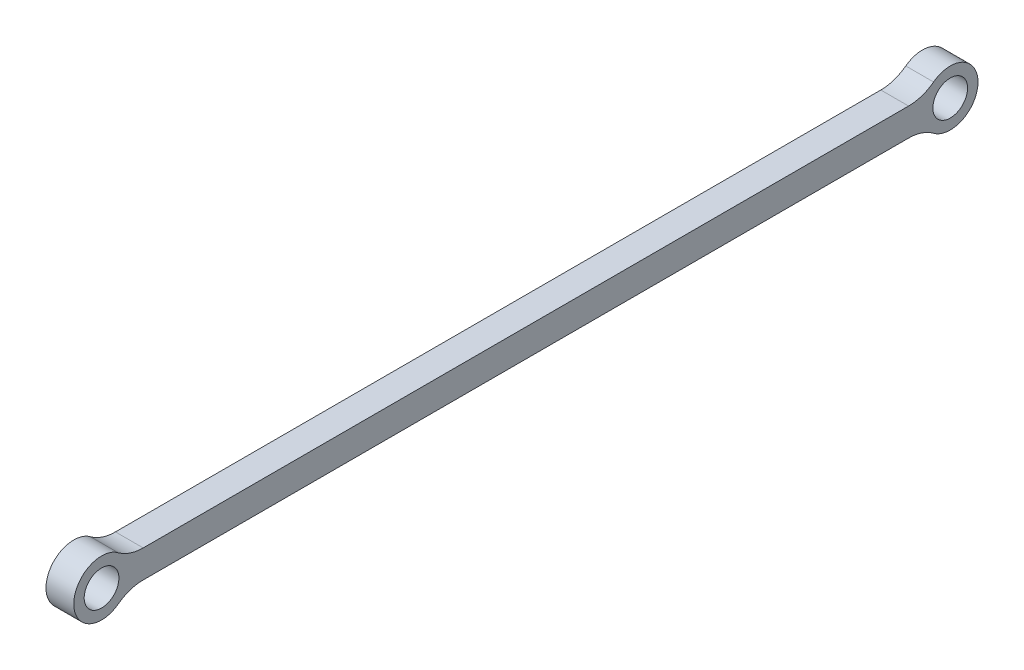
ISO-10303-21;
HEADER;
FILE_DESCRIPTION(('STEP AP214'),'2;1');
FILE_NAME('part.step','',(''),(''),'','','');
FILE_SCHEMA(('AUTOMOTIVE_DESIGN { 1 0 10303 214 1 1 1 1 }'));
ENDSEC;
DATA;
#1=APPLICATION_CONTEXT('core data for automotive mechanical design processes');
#2=APPLICATION_PROTOCOL_DEFINITION('international standard','automotive_design',2000,#1);
#3=PRODUCT_CONTEXT('',#1,'mechanical');
#4=PRODUCT('Part','Part','',(#3));
#5=PRODUCT_RELATED_PRODUCT_CATEGORY('part','',(#4));
#6=PRODUCT_DEFINITION_FORMATION('','',#4);
#7=PRODUCT_DEFINITION_CONTEXT('part definition',#1,'design');
#8=PRODUCT_DEFINITION('design','',#6,#7);
#9=PRODUCT_DEFINITION_SHAPE('','',#8);
#10=(LENGTH_UNIT() NAMED_UNIT(*) SI_UNIT(.MILLI.,.METRE.));
#11=(NAMED_UNIT(*) PLANE_ANGLE_UNIT() SI_UNIT($,.RADIAN.));
#12=(NAMED_UNIT(*) SI_UNIT($,.STERADIAN.) SOLID_ANGLE_UNIT());
#13=UNCERTAINTY_MEASURE_WITH_UNIT(LENGTH_MEASURE(1.E-05),#10,'distance_accuracy_value','');
#14=(GEOMETRIC_REPRESENTATION_CONTEXT(3) GLOBAL_UNCERTAINTY_ASSIGNED_CONTEXT((#13)) GLOBAL_UNIT_ASSIGNED_CONTEXT((#10,
#11,#12)) REPRESENTATION_CONTEXT('',''));
#15=CARTESIAN_POINT('',(0.,0.,0.));
#16=DIRECTION('',(0.,0.,1.));
#17=DIRECTION('',(1.,0.,0.));
#18=AXIS2_PLACEMENT_3D('',#15,#16,#17);
#19=CARTESIAN_POINT('',(8.,0.,0.));
#20=DIRECTION('',(1.,0.,0.));
#21=DIRECTION('',(0.,0.,-1.));
#22=AXIS2_PLACEMENT_3D('',#19,#20,#21);
#23=PLANE('',#22);
#24=DIRECTION('',(0.,0.,-1.));
#25=VECTOR('',#24,1.);
#26=CARTESIAN_POINT('',(8.,4.,-237.571796769724));
#27=LINE('',#26,#25);
#28=CARTESIAN_POINT('',(8.,3.99999999999997,-12.));
#29=VERTEX_POINT('',#28);
#30=CARTESIAN_POINT('',(8.,4.,-232.5));
#31=VERTEX_POINT('',#30);
#32=EDGE_CURVE('E133',#29,#31,#27,.T.);
#33=ORIENTED_EDGE('',*,*,#32,.F.);
#34=CARTESIAN_POINT('',(8.,16.,-12.));
#35=DIRECTION('',(1.,0.,0.));
#36=DIRECTION('',(0.,0.,-1.));
#37=AXIS2_PLACEMENT_3D('',#34,#35,#36);
#38=CIRCLE('',#37,12.);
#39=CARTESIAN_POINT('',(8.,6.39999999999999,-4.80000000000001));
#40=VERTEX_POINT('',#39);
#41=EDGE_CURVE('E168',#29,#40,#38,.F.);
#42=ORIENTED_EDGE('',*,*,#41,.T.);
#43=CARTESIAN_POINT('',(8.,0.,0.));
#44=DIRECTION('',(1.,0.,0.));
#45=DIRECTION('',(0.,0.,-1.));
#46=AXIS2_PLACEMENT_3D('',#43,#44,#45);
#47=CIRCLE('',#46,8.);
#48=CARTESIAN_POINT('',(8.,-6.39999999999999,-4.80000000000001));
#49=VERTEX_POINT('',#48);
#50=EDGE_CURVE('E150',#40,#49,#47,.T.);
#51=ORIENTED_EDGE('',*,*,#50,.T.);
#52=CARTESIAN_POINT('',(8.,-16.,-12.));
#53=DIRECTION('',(1.,0.,0.));
#54=DIRECTION('',(0.,0.,-1.));
#55=AXIS2_PLACEMENT_3D('',#52,#53,#54);
#56=CIRCLE('',#55,12.);
#57=CARTESIAN_POINT('',(8.,-3.99999999999997,-12.));
#58=VERTEX_POINT('',#57);
#59=EDGE_CURVE('E127',#49,#58,#56,.F.);
#60=ORIENTED_EDGE('',*,*,#59,.T.);
#61=DIRECTION('',(0.,0.,1.));
#62=VECTOR('',#61,1.);
#63=CARTESIAN_POINT('',(8.,-4.,-237.571796769724));
#64=LINE('',#63,#62);
#65=CARTESIAN_POINT('',(8.,-4.,-232.5));
#66=VERTEX_POINT('',#65);
#67=EDGE_CURVE('E105',#66,#58,#64,.T.);
#68=ORIENTED_EDGE('',*,*,#67,.F.);
#69=CARTESIAN_POINT('',(8.,-16.,-232.5));
#70=DIRECTION('',(1.,0.,0.));
#71=DIRECTION('',(0.,0.,-1.));
#72=AXIS2_PLACEMENT_3D('',#69,#70,#71);
#73=CIRCLE('',#72,12.);
#74=CARTESIAN_POINT('',(8.,-6.4,-239.7));
#75=VERTEX_POINT('',#74);
#76=EDGE_CURVE('E116',#66,#75,#73,.F.);
#77=ORIENTED_EDGE('',*,*,#76,.T.);
#78=CARTESIAN_POINT('',(8.,0.,-244.5));
#79=DIRECTION('',(1.,0.,0.));
#80=DIRECTION('',(0.,0.,-1.));
#81=AXIS2_PLACEMENT_3D('',#78,#79,#80);
#82=CIRCLE('',#81,8.);
#83=CARTESIAN_POINT('',(8.,6.4,-239.7));
#84=VERTEX_POINT('',#83);
#85=EDGE_CURVE('E152',#75,#84,#82,.T.);
#86=ORIENTED_EDGE('',*,*,#85,.T.);
#87=CARTESIAN_POINT('',(8.,16.,-232.5));
#88=DIRECTION('',(1.,0.,0.));
#89=DIRECTION('',(0.,0.,-1.));
#90=AXIS2_PLACEMENT_3D('',#87,#88,#89);
#91=CIRCLE('',#90,12.);
#92=EDGE_CURVE('E43',#84,#31,#91,.F.);
#93=ORIENTED_EDGE('',*,*,#92,.T.);
#94=EDGE_LOOP('',(#33,#42,#51,#60,#68,#77,#86,#93));
#95=FACE_BOUND('',#94,.T.);
#96=CARTESIAN_POINT('',(8.,0.,-244.5));
#97=DIRECTION('',(1.,0.,0.));
#98=DIRECTION('',(0.,0.,-1.));
#99=AXIS2_PLACEMENT_3D('',#96,#97,#98);
#100=CIRCLE('',#99,4.99999999999999);
#101=CARTESIAN_POINT('',(8.,0.,-249.5));
#102=VERTEX_POINT('',#101);
#103=EDGE_CURVE('E144',#102,#102,#100,.T.);
#104=ORIENTED_EDGE('',*,*,#103,.F.);
#105=EDGE_LOOP('',(#104));
#106=FACE_BOUND('',#105,.T.);
#107=CARTESIAN_POINT('',(8.,0.,0.));
#108=DIRECTION('',(1.,0.,0.));
#109=DIRECTION('',(0.,0.,-1.));
#110=AXIS2_PLACEMENT_3D('',#107,#108,#109);
#111=CIRCLE('',#110,5.);
#112=CARTESIAN_POINT('',(8.,0.,-5.));
#113=VERTEX_POINT('',#112);
#114=EDGE_CURVE('E138',#113,#113,#111,.T.);
#115=ORIENTED_EDGE('',*,*,#114,.F.);
#116=EDGE_LOOP('',(#115));
#117=FACE_BOUND('',#116,.T.);
#118=ADVANCED_FACE('F35',(#95,#106,#117),#23,.T.);
#119=CARTESIAN_POINT('',(0.,0.,0.));
#120=DIRECTION('',(1.,0.,0.));
#121=DIRECTION('',(0.,0.,-1.));
#122=AXIS2_PLACEMENT_3D('',#119,#120,#121);
#123=PLANE('',#122);
#124=CARTESIAN_POINT('',(0.,0.,-244.5));
#125=DIRECTION('',(1.,0.,0.));
#126=DIRECTION('',(0.,0.,-1.));
#127=AXIS2_PLACEMENT_3D('',#124,#125,#126);
#128=CIRCLE('',#127,8.);
#129=CARTESIAN_POINT('',(0.,-6.4,-239.7));
#130=VERTEX_POINT('',#129);
#131=CARTESIAN_POINT('',(0.,6.4,-239.7));
#132=VERTEX_POINT('',#131);
#133=EDGE_CURVE('E153',#130,#132,#128,.T.);
#134=ORIENTED_EDGE('',*,*,#133,.F.);
#135=CARTESIAN_POINT('',(0.,-16.,-232.5));
#136=DIRECTION('',(1.,0.,0.));
#137=DIRECTION('',(0.,0.,-1.));
#138=AXIS2_PLACEMENT_3D('',#135,#136,#137);
#139=CIRCLE('',#138,12.);
#140=CARTESIAN_POINT('',(0.,-4.,-232.5));
#141=VERTEX_POINT('',#140);
#142=EDGE_CURVE('E122',#130,#141,#139,.T.);
#143=ORIENTED_EDGE('',*,*,#142,.T.);
#144=DIRECTION('',(0.,0.,1.));
#145=VECTOR('',#144,1.);
#146=CARTESIAN_POINT('',(0.,-4.,-237.571796769724));
#147=LINE('',#146,#145);
#148=CARTESIAN_POINT('',(0.,-3.99999999999997,-12.));
#149=VERTEX_POINT('',#148);
#150=EDGE_CURVE('E108',#141,#149,#147,.T.);
#151=ORIENTED_EDGE('',*,*,#150,.T.);
#152=CARTESIAN_POINT('',(0.,-16.,-12.));
#153=DIRECTION('',(1.,0.,0.));
#154=DIRECTION('',(0.,0.,-1.));
#155=AXIS2_PLACEMENT_3D('',#152,#153,#154);
#156=CIRCLE('',#155,12.);
#157=CARTESIAN_POINT('',(0.,-6.39999999999999,-4.80000000000001));
#158=VERTEX_POINT('',#157);
#159=EDGE_CURVE('E175',#149,#158,#156,.T.);
#160=ORIENTED_EDGE('',*,*,#159,.T.);
#161=CARTESIAN_POINT('',(0.,0.,0.));
#162=DIRECTION('',(1.,0.,0.));
#163=DIRECTION('',(0.,0.,-1.));
#164=AXIS2_PLACEMENT_3D('',#161,#162,#163);
#165=CIRCLE('',#164,8.);
#166=CARTESIAN_POINT('',(0.,6.39999999999999,-4.80000000000001));
#167=VERTEX_POINT('',#166);
#168=EDGE_CURVE('E147',#167,#158,#165,.T.);
#169=ORIENTED_EDGE('',*,*,#168,.F.);
#170=CARTESIAN_POINT('',(0.,16.,-12.));
#171=DIRECTION('',(1.,0.,0.));
#172=DIRECTION('',(0.,0.,-1.));
#173=AXIS2_PLACEMENT_3D('',#170,#171,#172);
#174=CIRCLE('',#173,12.);
#175=CARTESIAN_POINT('',(0.,3.99999999999997,-12.));
#176=VERTEX_POINT('',#175);
#177=EDGE_CURVE('E171',#167,#176,#174,.T.);
#178=ORIENTED_EDGE('',*,*,#177,.T.);
#179=DIRECTION('',(0.,0.,-1.));
#180=VECTOR('',#179,1.);
#181=CARTESIAN_POINT('',(0.,4.,-237.571796769724));
#182=LINE('',#181,#180);
#183=CARTESIAN_POINT('',(0.,4.,-232.5));
#184=VERTEX_POINT('',#183);
#185=EDGE_CURVE('E128',#176,#184,#182,.T.);
#186=ORIENTED_EDGE('',*,*,#185,.T.);
#187=CARTESIAN_POINT('',(0.,16.,-232.5));
#188=DIRECTION('',(1.,0.,0.));
#189=DIRECTION('',(0.,0.,-1.));
#190=AXIS2_PLACEMENT_3D('',#187,#188,#189);
#191=CIRCLE('',#190,12.);
#192=EDGE_CURVE('E11',#184,#132,#191,.T.);
#193=ORIENTED_EDGE('',*,*,#192,.T.);
#194=EDGE_LOOP('',(#134,#143,#151,#160,#169,#178,#186,#193));
#195=FACE_BOUND('',#194,.T.);
#196=CARTESIAN_POINT('',(0.,0.,-244.5));
#197=DIRECTION('',(1.,0.,0.));
#198=DIRECTION('',(0.,0.,-1.));
#199=AXIS2_PLACEMENT_3D('',#196,#197,#198);
#200=CIRCLE('',#199,4.99999999999999);
#201=CARTESIAN_POINT('',(0.,0.,-249.5));
#202=VERTEX_POINT('',#201);
#203=EDGE_CURVE('E141',#202,#202,#200,.T.);
#204=ORIENTED_EDGE('',*,*,#203,.T.);
#205=EDGE_LOOP('',(#204));
#206=FACE_BOUND('',#205,.T.);
#207=CARTESIAN_POINT('',(0.,0.,0.));
#208=DIRECTION('',(1.,0.,0.));
#209=DIRECTION('',(0.,0.,-1.));
#210=AXIS2_PLACEMENT_3D('',#207,#208,#209);
#211=CIRCLE('',#210,5.);
#212=CARTESIAN_POINT('',(0.,0.,-5.));
#213=VERTEX_POINT('',#212);
#214=EDGE_CURVE('E130',#213,#213,#211,.T.);
#215=ORIENTED_EDGE('',*,*,#214,.T.);
#216=EDGE_LOOP('',(#215));
#217=FACE_BOUND('',#216,.T.);
#218=ADVANCED_FACE('F189',(#195,#206,#217),#123,.F.);
#219=CARTESIAN_POINT('',(8.,0.,0.));
#220=DIRECTION('',(-1.,0.,0.));
#221=DIRECTION('',(0.,0.,1.));
#222=AXIS2_PLACEMENT_3D('',#219,#220,#221);
#223=CYLINDRICAL_SURFACE('',#222,8.);
#224=ORIENTED_EDGE('',*,*,#50,.F.);
#225=DIRECTION('',(-1.,0.,0.));
#226=VECTOR('',#225,1.);
#227=CARTESIAN_POINT('',(8.,6.39999999999999,-4.80000000000001));
#228=LINE('',#227,#226);
#229=EDGE_CURVE('E58',#40,#167,#228,.T.);
#230=ORIENTED_EDGE('',*,*,#229,.T.);
#231=ORIENTED_EDGE('',*,*,#168,.T.);
#232=DIRECTION('',(-1.,0.,0.));
#233=VECTOR('',#232,1.);
#234=CARTESIAN_POINT('',(8.,-6.39999999999999,-4.80000000000001));
#235=LINE('',#234,#233);
#236=EDGE_CURVE('E50',#158,#49,#235,.F.);
#237=ORIENTED_EDGE('',*,*,#236,.T.);
#238=EDGE_LOOP('',(#224,#230,#231,#237));
#239=FACE_BOUND('',#238,.T.);
#240=ADVANCED_FACE('F185',(#239),#223,.T.);
#241=CARTESIAN_POINT('',(8.,0.,-244.5));
#242=DIRECTION('',(-1.,0.,0.));
#243=DIRECTION('',(0.,0.,1.));
#244=AXIS2_PLACEMENT_3D('',#241,#242,#243);
#245=CYLINDRICAL_SURFACE('',#244,8.);
#246=ORIENTED_EDGE('',*,*,#85,.F.);
#247=DIRECTION('',(-1.,0.,0.));
#248=VECTOR('',#247,1.);
#249=CARTESIAN_POINT('',(8.,-6.4,-239.7));
#250=LINE('',#249,#248);
#251=EDGE_CURVE('E118',#75,#130,#250,.T.);
#252=ORIENTED_EDGE('',*,*,#251,.T.);
#253=ORIENTED_EDGE('',*,*,#133,.T.);
#254=DIRECTION('',(-1.,0.,0.));
#255=VECTOR('',#254,1.);
#256=CARTESIAN_POINT('',(8.,6.4,-239.7));
#257=LINE('',#256,#255);
#258=EDGE_CURVE('E112',#132,#84,#257,.F.);
#259=ORIENTED_EDGE('',*,*,#258,.T.);
#260=EDGE_LOOP('',(#246,#252,#253,#259));
#261=FACE_BOUND('',#260,.T.);
#262=ADVANCED_FACE('F210',(#261),#245,.T.);
#263=CARTESIAN_POINT('',(8.,0.,-244.5));
#264=DIRECTION('',(-1.,0.,0.));
#265=DIRECTION('',(0.,0.,1.));
#266=AXIS2_PLACEMENT_3D('',#263,#264,#265);
#267=CYLINDRICAL_SURFACE('',#266,4.99999999999999);
#268=ORIENTED_EDGE('',*,*,#103,.T.);
#269=EDGE_LOOP('',(#268));
#270=FACE_BOUND('',#269,.T.);
#271=ORIENTED_EDGE('',*,*,#203,.F.);
#272=EDGE_LOOP('',(#271));
#273=FACE_BOUND('',#272,.T.);
#274=ADVANCED_FACE('F207',(#270,#273),#267,.F.);
#275=CARTESIAN_POINT('',(8.,0.,0.));
#276=DIRECTION('',(-1.,0.,0.));
#277=DIRECTION('',(0.,0.,1.));
#278=AXIS2_PLACEMENT_3D('',#275,#276,#277);
#279=CYLINDRICAL_SURFACE('',#278,5.);
#280=ORIENTED_EDGE('',*,*,#114,.T.);
#281=EDGE_LOOP('',(#280));
#282=FACE_BOUND('',#281,.T.);
#283=ORIENTED_EDGE('',*,*,#214,.F.);
#284=EDGE_LOOP('',(#283));
#285=FACE_BOUND('',#284,.T.);
#286=ADVANCED_FACE('F224',(#282,#285),#279,.F.);
#287=CARTESIAN_POINT('',(0.,4.,-237.571796769724));
#288=DIRECTION('',(0.,-1.,0.));
#289=DIRECTION('',(0.,0.,-1.));
#290=AXIS2_PLACEMENT_3D('',#287,#288,#289);
#291=PLANE('',#290);
#292=ORIENTED_EDGE('',*,*,#185,.F.);
#293=DIRECTION('',(1.,0.,0.));
#294=VECTOR('',#293,1.);
#295=CARTESIAN_POINT('',(8.,3.99999999999997,-12.));
#296=LINE('',#295,#294);
#297=EDGE_CURVE('E163',#176,#29,#296,.T.);
#298=ORIENTED_EDGE('',*,*,#297,.T.);
#299=ORIENTED_EDGE('',*,*,#32,.T.);
#300=DIRECTION('',(1.,0.,0.));
#301=VECTOR('',#300,1.);
#302=CARTESIAN_POINT('',(0.,4.,-232.5));
#303=LINE('',#302,#301);
#304=EDGE_CURVE('E161',#31,#184,#303,.F.);
#305=ORIENTED_EDGE('',*,*,#304,.T.);
#306=EDGE_LOOP('',(#292,#298,#299,#305));
#307=FACE_BOUND('',#306,.T.);
#308=ADVANCED_FACE('F182',(#307),#291,.F.);
#309=CARTESIAN_POINT('',(0.,-4.,-237.571796769724));
#310=DIRECTION('',(0.,1.,0.));
#311=DIRECTION('',(0.,0.,1.));
#312=AXIS2_PLACEMENT_3D('',#309,#310,#311);
#313=PLANE('',#312);
#314=ORIENTED_EDGE('',*,*,#150,.F.);
#315=DIRECTION('',(1.,0.,0.));
#316=VECTOR('',#315,1.);
#317=CARTESIAN_POINT('',(8.,-4.,-232.5));
#318=LINE('',#317,#316);
#319=EDGE_CURVE('E101',#141,#66,#318,.T.);
#320=ORIENTED_EDGE('',*,*,#319,.T.);
#321=ORIENTED_EDGE('',*,*,#67,.T.);
#322=DIRECTION('',(1.,0.,0.));
#323=VECTOR('',#322,1.);
#324=CARTESIAN_POINT('',(0.,-3.99999999999997,-12.));
#325=LINE('',#324,#323);
#326=EDGE_CURVE('E113',#58,#149,#325,.F.);
#327=ORIENTED_EDGE('',*,*,#326,.T.);
#328=EDGE_LOOP('',(#314,#320,#321,#327));
#329=FACE_BOUND('',#328,.T.);
#330=ADVANCED_FACE('F103',(#329),#313,.F.);
#331=CARTESIAN_POINT('',(8.,-16.,-232.5));
#332=DIRECTION('',(-1.,0.,0.));
#333=DIRECTION('',(0.,0.,1.));
#334=AXIS2_PLACEMENT_3D('',#331,#332,#333);
#335=CYLINDRICAL_SURFACE('',#334,12.);
#336=ORIENTED_EDGE('',*,*,#142,.F.);
#337=ORIENTED_EDGE('',*,*,#251,.F.);
#338=ORIENTED_EDGE('',*,*,#76,.F.);
#339=ORIENTED_EDGE('',*,*,#319,.F.);
#340=EDGE_LOOP('',(#336,#337,#338,#339));
#341=FACE_BOUND('',#340,.T.);
#342=ADVANCED_FACE('F117',(#341),#335,.F.);
#343=CARTESIAN_POINT('',(8.,16.,-12.));
#344=DIRECTION('',(-1.,0.,0.));
#345=DIRECTION('',(0.,0.,1.));
#346=AXIS2_PLACEMENT_3D('',#343,#344,#345);
#347=CYLINDRICAL_SURFACE('',#346,12.);
#348=ORIENTED_EDGE('',*,*,#177,.F.);
#349=ORIENTED_EDGE('',*,*,#229,.F.);
#350=ORIENTED_EDGE('',*,*,#41,.F.);
#351=ORIENTED_EDGE('',*,*,#297,.F.);
#352=EDGE_LOOP('',(#348,#349,#350,#351));
#353=FACE_BOUND('',#352,.T.);
#354=ADVANCED_FACE('F184',(#353),#347,.F.);
#355=CARTESIAN_POINT('',(8.,-16.,-12.));
#356=DIRECTION('',(-1.,0.,0.));
#357=DIRECTION('',(0.,0.,1.));
#358=AXIS2_PLACEMENT_3D('',#355,#356,#357);
#359=CYLINDRICAL_SURFACE('',#358,12.);
#360=ORIENTED_EDGE('',*,*,#159,.F.);
#361=ORIENTED_EDGE('',*,*,#326,.F.);
#362=ORIENTED_EDGE('',*,*,#59,.F.);
#363=ORIENTED_EDGE('',*,*,#236,.F.);
#364=EDGE_LOOP('',(#360,#361,#362,#363));
#365=FACE_BOUND('',#364,.T.);
#366=ADVANCED_FACE('F193',(#365),#359,.F.);
#367=CARTESIAN_POINT('',(8.,16.,-232.5));
#368=DIRECTION('',(-1.,0.,0.));
#369=DIRECTION('',(0.,0.,1.));
#370=AXIS2_PLACEMENT_3D('',#367,#368,#369);
#371=CYLINDRICAL_SURFACE('',#370,12.);
#372=ORIENTED_EDGE('',*,*,#192,.F.);
#373=ORIENTED_EDGE('',*,*,#304,.F.);
#374=ORIENTED_EDGE('',*,*,#92,.F.);
#375=ORIENTED_EDGE('',*,*,#258,.F.);
#376=EDGE_LOOP('',(#372,#373,#374,#375));
#377=FACE_BOUND('',#376,.T.);
#378=ADVANCED_FACE('F37',(#377),#371,.F.);
#379=CLOSED_SHELL('',(#118,#218,#240,#262,#274,#286,#308,#330,#342,#354,#366,#378));
#380=MANIFOLD_SOLID_BREP('B2',#379);
#381=ADVANCED_BREP_SHAPE_REPRESENTATION('',(#18,#380),#14);
#382=SHAPE_DEFINITION_REPRESENTATION(#9,#381);
ENDSEC;
END-ISO-10303-21;
